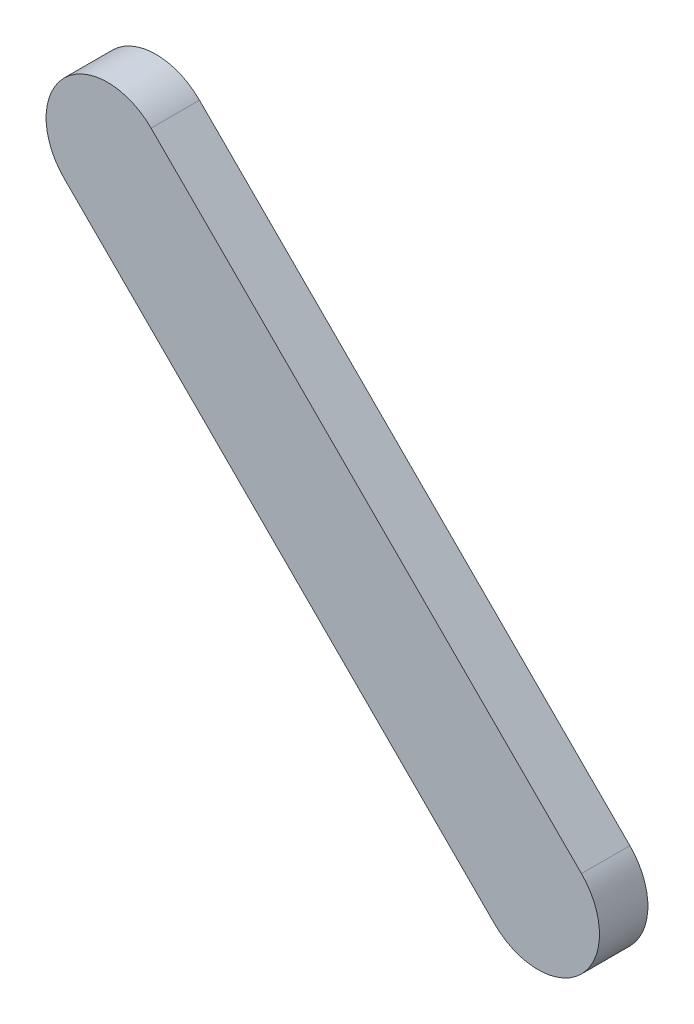
ISO-10303-21;
HEADER;
FILE_DESCRIPTION(('STEP AP214'),'2;1');
FILE_NAME('part.step','',(''),(''),'','','');
FILE_SCHEMA(('AUTOMOTIVE_DESIGN { 1 0 10303 214 1 1 1 1 }'));
ENDSEC;
DATA;
#1=APPLICATION_CONTEXT('core data for automotive mechanical design processes');
#2=APPLICATION_PROTOCOL_DEFINITION('international standard','automotive_design',2000,#1);
#3=PRODUCT_CONTEXT('',#1,'mechanical');
#4=PRODUCT('Part','Part','',(#3));
#5=PRODUCT_RELATED_PRODUCT_CATEGORY('part','',(#4));
#6=PRODUCT_DEFINITION_FORMATION('','',#4);
#7=PRODUCT_DEFINITION_CONTEXT('part definition',#1,'design');
#8=PRODUCT_DEFINITION('design','',#6,#7);
#9=PRODUCT_DEFINITION_SHAPE('','',#8);
#10=(LENGTH_UNIT() NAMED_UNIT(*) SI_UNIT(.MILLI.,.METRE.));
#11=(NAMED_UNIT(*) PLANE_ANGLE_UNIT() SI_UNIT($,.RADIAN.));
#12=(NAMED_UNIT(*) SI_UNIT($,.STERADIAN.) SOLID_ANGLE_UNIT());
#13=UNCERTAINTY_MEASURE_WITH_UNIT(LENGTH_MEASURE(1.E-05),#10,'distance_accuracy_value','');
#14=(GEOMETRIC_REPRESENTATION_CONTEXT(3) GLOBAL_UNCERTAINTY_ASSIGNED_CONTEXT((#13)) GLOBAL_UNIT_ASSIGNED_CONTEXT((#10,
#11,#12)) REPRESENTATION_CONTEXT('',''));
#15=CARTESIAN_POINT('',(0.,0.,0.));
#16=DIRECTION('',(0.,0.,1.));
#17=DIRECTION('',(1.,0.,0.));
#18=AXIS2_PLACEMENT_3D('',#15,#16,#17);
#19=CARTESIAN_POINT('',(132.28139406,58.7483966,0.));
#20=DIRECTION('',(0.707106781186545,0.70710678118655,0.));
#21=DIRECTION('',(0.70710678118655,-0.707106781186545,0.));
#22=AXIS2_PLACEMENT_3D('',#19,#20,#21);
#23=PLANE('',#22);
#24=DIRECTION('',(0.70710678118655,-0.707106781186545,0.));
#25=VECTOR('',#24,1.);
#26=CARTESIAN_POINT('',(132.28139406,58.7483966,0.1999996));
#27=LINE('',#26,#25);
#28=CARTESIAN_POINT('',(132.28139406,58.7483966,0.1999996));
#29=VERTEX_POINT('',#28);
#30=CARTESIAN_POINT('',(134.0593966,56.97039406,0.1999996));
#31=VERTEX_POINT('',#30);
#32=EDGE_CURVE('E11',#29,#31,#27,.T.);
#33=ORIENTED_EDGE('',*,*,#32,.F.);
#34=DIRECTION('',(0.,0.,1.));
#35=VECTOR('',#34,1.);
#36=CARTESIAN_POINT('',(132.28139406,58.7483966,0.));
#37=LINE('',#36,#35);
#38=CARTESIAN_POINT('',(132.28139406,58.7483966,0.));
#39=VERTEX_POINT('',#38);
#40=EDGE_CURVE('E24',#39,#29,#37,.T.);
#41=ORIENTED_EDGE('',*,*,#40,.F.);
#42=DIRECTION('',(0.70710678118655,-0.707106781186545,0.));
#43=VECTOR('',#42,1.);
#44=CARTESIAN_POINT('',(132.28139406,58.7483966,0.));
#45=LINE('',#44,#43);
#46=CARTESIAN_POINT('',(134.0593966,56.97039406,0.));
#47=VERTEX_POINT('',#46);
#48=EDGE_CURVE('E75',#39,#47,#45,.T.);
#49=ORIENTED_EDGE('',*,*,#48,.T.);
#50=DIRECTION('',(0.,0.,1.));
#51=VECTOR('',#50,1.);
#52=CARTESIAN_POINT('',(134.0593966,56.97039406,0.));
#53=LINE('',#52,#51);
#54=EDGE_CURVE('E37',#47,#31,#53,.T.);
#55=ORIENTED_EDGE('',*,*,#54,.T.);
#56=EDGE_LOOP('',(#33,#41,#49,#55));
#57=FACE_BOUND('',#56,.T.);
#58=ADVANCED_FACE('F17',(#57),#23,.F.);
#59=CARTESIAN_POINT('',(134.23900127,57.14999873,0.));
#60=DIRECTION('',(0.,0.,-1.));
#61=DIRECTION('',(-0.707106781186562,-0.707106781186534,0.));
#62=AXIS2_PLACEMENT_3D('',#59,#60,#61);
#63=CYLINDRICAL_SURFACE('',#62,0.253999360179532);
#64=CARTESIAN_POINT('',(134.23900127,57.14999873,0.1999996));
#65=DIRECTION('',(0.,0.,1.));
#66=DIRECTION('',(-0.707106781186562,-0.707106781186534,0.));
#67=AXIS2_PLACEMENT_3D('',#64,#65,#66);
#68=CIRCLE('',#67,0.253999360179532);
#69=CARTESIAN_POINT('',(134.41860594,57.3296034,0.1999996));
#70=VERTEX_POINT('',#69);
#71=EDGE_CURVE('E83',#31,#70,#68,.T.);
#72=ORIENTED_EDGE('',*,*,#71,.F.);
#73=ORIENTED_EDGE('',*,*,#54,.F.);
#74=CARTESIAN_POINT('',(134.23900127,57.14999873,0.));
#75=DIRECTION('',(0.,0.,1.));
#76=DIRECTION('',(-0.707106781186562,-0.707106781186534,0.));
#77=AXIS2_PLACEMENT_3D('',#74,#75,#76);
#78=CIRCLE('',#77,0.253999360179532);
#79=CARTESIAN_POINT('',(134.41860594,57.3296034,0.));
#80=VERTEX_POINT('',#79);
#81=EDGE_CURVE('E81',#47,#80,#78,.T.);
#82=ORIENTED_EDGE('',*,*,#81,.T.);
#83=DIRECTION('',(0.,0.,1.));
#84=VECTOR('',#83,1.);
#85=CARTESIAN_POINT('',(134.41860594,57.3296034,0.));
#86=LINE('',#85,#84);
#87=EDGE_CURVE('E67',#80,#70,#86,.T.);
#88=ORIENTED_EDGE('',*,*,#87,.T.);
#89=EDGE_LOOP('',(#72,#73,#82,#88));
#90=FACE_BOUND('',#89,.T.);
#91=ADVANCED_FACE('F89',(#90),#63,.T.);
#92=CARTESIAN_POINT('',(134.41860594,57.3296034,0.));
#93=DIRECTION('',(-0.707106781186552,-0.707106781186543,0.));
#94=DIRECTION('',(-0.707106781186543,0.707106781186552,0.));
#95=AXIS2_PLACEMENT_3D('',#92,#93,#94);
#96=PLANE('',#95);
#97=DIRECTION('',(-0.707106781186543,0.707106781186552,0.));
#98=VECTOR('',#97,1.);
#99=CARTESIAN_POINT('',(134.41860594,57.3296034,0.1999996));
#100=LINE('',#99,#98);
#101=CARTESIAN_POINT('',(132.6406034,59.10760594,0.1999996));
#102=VERTEX_POINT('',#101);
#103=EDGE_CURVE('E71',#70,#102,#100,.T.);
#104=ORIENTED_EDGE('',*,*,#103,.F.);
#105=ORIENTED_EDGE('',*,*,#87,.F.);
#106=DIRECTION('',(-0.707106781186543,0.707106781186552,0.));
#107=VECTOR('',#106,1.);
#108=CARTESIAN_POINT('',(134.41860594,57.3296034,0.));
#109=LINE('',#108,#107);
#110=CARTESIAN_POINT('',(132.6406034,59.10760594,0.));
#111=VERTEX_POINT('',#110);
#112=EDGE_CURVE('E63',#80,#111,#109,.T.);
#113=ORIENTED_EDGE('',*,*,#112,.T.);
#114=DIRECTION('',(0.,0.,1.));
#115=VECTOR('',#114,1.);
#116=CARTESIAN_POINT('',(132.6406034,59.10760594,0.));
#117=LINE('',#116,#115);
#118=EDGE_CURVE('E53',#111,#102,#117,.T.);
#119=ORIENTED_EDGE('',*,*,#118,.T.);
#120=EDGE_LOOP('',(#104,#105,#113,#119));
#121=FACE_BOUND('',#120,.T.);
#122=ADVANCED_FACE('F66',(#121),#96,.F.);
#123=CARTESIAN_POINT('',(132.46099873,58.92800127,0.));
#124=DIRECTION('',(0.,0.,-1.));
#125=DIRECTION('',(0.707106781186548,0.707106781186548,0.));
#126=AXIS2_PLACEMENT_3D('',#123,#124,#125);
#127=CYLINDRICAL_SURFACE('',#126,0.253999360179549);
#128=CARTESIAN_POINT('',(132.46099873,58.92800127,0.1999996));
#129=DIRECTION('',(0.,0.,1.));
#130=DIRECTION('',(0.707106781186548,0.707106781186548,0.));
#131=AXIS2_PLACEMENT_3D('',#128,#129,#130);
#132=CIRCLE('',#131,0.253999360179549);
#133=EDGE_CURVE('E59',#102,#29,#132,.T.);
#134=ORIENTED_EDGE('',*,*,#133,.F.);
#135=ORIENTED_EDGE('',*,*,#118,.F.);
#136=CARTESIAN_POINT('',(132.46099873,58.92800127,0.));
#137=DIRECTION('',(0.,0.,1.));
#138=DIRECTION('',(0.707106781186548,0.707106781186548,0.));
#139=AXIS2_PLACEMENT_3D('',#136,#137,#138);
#140=CIRCLE('',#139,0.253999360179549);
#141=EDGE_CURVE('E57',#111,#39,#140,.T.);
#142=ORIENTED_EDGE('',*,*,#141,.T.);
#143=ORIENTED_EDGE('',*,*,#40,.T.);
#144=EDGE_LOOP('',(#134,#135,#142,#143));
#145=FACE_BOUND('',#144,.T.);
#146=ADVANCED_FACE('F55',(#145),#127,.T.);
#147=CARTESIAN_POINT('',(132.28139406,58.7483966,0.));
#148=DIRECTION('',(0.,0.,-1.));
#149=DIRECTION('',(-1.,0.,0.));
#150=AXIS2_PLACEMENT_3D('',#147,#148,#149);
#151=PLANE('',#150);
#152=ORIENTED_EDGE('',*,*,#141,.F.);
#153=ORIENTED_EDGE('',*,*,#112,.F.);
#154=ORIENTED_EDGE('',*,*,#81,.F.);
#155=ORIENTED_EDGE('',*,*,#48,.F.);
#156=EDGE_LOOP('',(#152,#153,#154,#155));
#157=FACE_BOUND('',#156,.T.);
#158=ADVANCED_FACE('F74',(#157),#151,.T.);
#159=CARTESIAN_POINT('',(132.28139406,58.7483966,0.1999996));
#160=DIRECTION('',(0.,0.,-1.));
#161=DIRECTION('',(-1.,0.,0.));
#162=AXIS2_PLACEMENT_3D('',#159,#160,#161);
#163=PLANE('',#162);
#164=ORIENTED_EDGE('',*,*,#32,.T.);
#165=ORIENTED_EDGE('',*,*,#71,.T.);
#166=ORIENTED_EDGE('',*,*,#103,.T.);
#167=ORIENTED_EDGE('',*,*,#133,.T.);
#168=EDGE_LOOP('',(#164,#165,#166,#167));
#169=FACE_BOUND('',#168,.T.);
#170=ADVANCED_FACE('F91',(#169),#163,.F.);
#171=CLOSED_SHELL('',(#58,#91,#122,#146,#158,#170));
#172=MANIFOLD_SOLID_BREP('B1',#171);
#173=ADVANCED_BREP_SHAPE_REPRESENTATION('',(#18,#172),#14);
#174=SHAPE_DEFINITION_REPRESENTATION(#9,#173);
ENDSEC;
END-ISO-10303-21;
